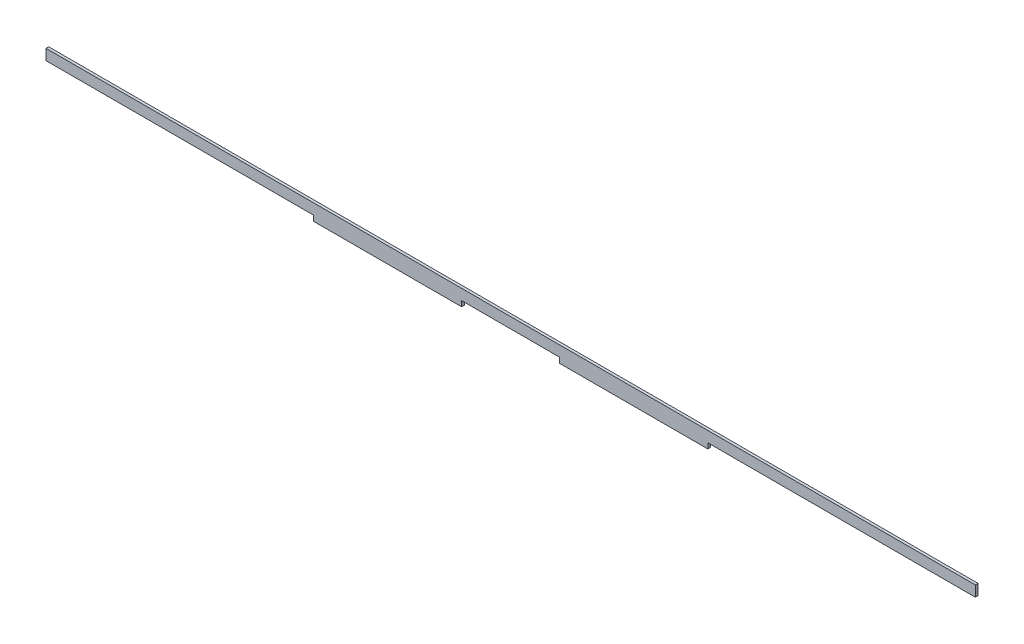
ISO-10303-21;
HEADER;
FILE_DESCRIPTION(('STEP AP214'),'2;1');
FILE_NAME('part.step','',(''),(''),'','','');
FILE_SCHEMA(('AUTOMOTIVE_DESIGN { 1 0 10303 214 1 1 1 1 }'));
ENDSEC;
DATA;
#1=APPLICATION_CONTEXT('core data for automotive mechanical design processes');
#2=APPLICATION_PROTOCOL_DEFINITION('international standard','automotive_design',2000,#1);
#3=PRODUCT_CONTEXT('',#1,'mechanical');
#4=PRODUCT('Part','Part','',(#3));
#5=PRODUCT_RELATED_PRODUCT_CATEGORY('part','',(#4));
#6=PRODUCT_DEFINITION_FORMATION('','',#4);
#7=PRODUCT_DEFINITION_CONTEXT('part definition',#1,'design');
#8=PRODUCT_DEFINITION('design','',#6,#7);
#9=PRODUCT_DEFINITION_SHAPE('','',#8);
#10=(LENGTH_UNIT() NAMED_UNIT(*) SI_UNIT(.MILLI.,.METRE.));
#11=(NAMED_UNIT(*) PLANE_ANGLE_UNIT() SI_UNIT($,.RADIAN.));
#12=(NAMED_UNIT(*) SI_UNIT($,.STERADIAN.) SOLID_ANGLE_UNIT());
#13=UNCERTAINTY_MEASURE_WITH_UNIT(LENGTH_MEASURE(1.E-05),#10,'distance_accuracy_value','');
#14=(GEOMETRIC_REPRESENTATION_CONTEXT(3) GLOBAL_UNCERTAINTY_ASSIGNED_CONTEXT((#13)) GLOBAL_UNIT_ASSIGNED_CONTEXT((#10,
#11,#12)) REPRESENTATION_CONTEXT('',''));
#15=CARTESIAN_POINT('',(0.,0.,0.));
#16=DIRECTION('',(0.,0.,1.));
#17=DIRECTION('',(1.,0.,0.));
#18=AXIS2_PLACEMENT_3D('',#15,#16,#17);
#19=CARTESIAN_POINT('',(49.8374939514051,7.71576479761275,3.));
#20=DIRECTION('',(1.,0.,0.));
#21=DIRECTION('',(0.,0.,-1.));
#22=AXIS2_PLACEMENT_3D('',#19,#20,#21);
#23=PLANE('',#22);
#24=DIRECTION('',(0.,-1.,0.));
#25=VECTOR('',#24,1.);
#26=CARTESIAN_POINT('',(49.8374939514051,7.71576479761275,0.));
#27=LINE('',#26,#25);
#28=CARTESIAN_POINT('',(49.8374939514051,7.71576479761275,0.));
#29=VERTEX_POINT('',#28);
#30=CARTESIAN_POINT('',(49.8374939514051,1.71576479761275,0.));
#31=VERTEX_POINT('',#30);
#32=EDGE_CURVE('E163',#29,#31,#27,.T.);
#33=ORIENTED_EDGE('',*,*,#32,.T.);
#34=DIRECTION('',(0.,0.,-1.));
#35=VECTOR('',#34,1.);
#36=CARTESIAN_POINT('',(49.8374939514051,1.71576479761275,3.));
#37=LINE('',#36,#35);
#38=CARTESIAN_POINT('',(49.8374939514051,1.71576479761275,3.));
#39=VERTEX_POINT('',#38);
#40=EDGE_CURVE('E11',#39,#31,#37,.T.);
#41=ORIENTED_EDGE('',*,*,#40,.F.);
#42=DIRECTION('',(0.,-1.,0.));
#43=VECTOR('',#42,1.);
#44=CARTESIAN_POINT('',(49.8374939514051,7.71576479761275,3.));
#45=LINE('',#44,#43);
#46=CARTESIAN_POINT('',(49.8374939514051,7.71576479761275,3.));
#47=VERTEX_POINT('',#46);
#48=EDGE_CURVE('E192',#47,#39,#45,.T.);
#49=ORIENTED_EDGE('',*,*,#48,.F.);
#50=DIRECTION('',(0.,0.,-1.));
#51=VECTOR('',#50,1.);
#52=CARTESIAN_POINT('',(49.8374939514051,7.71576479761275,3.));
#53=LINE('',#52,#51);
#54=EDGE_CURVE('E162',#47,#29,#53,.T.);
#55=ORIENTED_EDGE('',*,*,#54,.T.);
#56=EDGE_LOOP('',(#33,#41,#49,#55));
#57=FACE_BOUND('',#56,.T.);
#58=ADVANCED_FACE('F41',(#57),#23,.F.);
#59=CARTESIAN_POINT('',(49.8374939514051,1.71576479761275,3.));
#60=DIRECTION('',(0.,1.,0.));
#61=DIRECTION('',(-1.,0.,0.));
#62=AXIS2_PLACEMENT_3D('',#59,#60,#61);
#63=PLANE('',#62);
#64=DIRECTION('',(1.,0.,0.));
#65=VECTOR('',#64,1.);
#66=CARTESIAN_POINT('',(49.8374939514051,1.71576479761275,0.));
#67=LINE('',#66,#65);
#68=CARTESIAN_POINT('',(215.837493951405,1.71576479761275,0.));
#69=VERTEX_POINT('',#68);
#70=EDGE_CURVE('E166',#31,#69,#67,.T.);
#71=ORIENTED_EDGE('',*,*,#70,.T.);
#72=DIRECTION('',(0.,0.,-1.));
#73=VECTOR('',#72,1.);
#74=CARTESIAN_POINT('',(215.837493951405,1.71576479761275,3.));
#75=LINE('',#74,#73);
#76=CARTESIAN_POINT('',(215.837493951405,1.71576479761275,3.));
#77=VERTEX_POINT('',#76);
#78=EDGE_CURVE('E49',#77,#69,#75,.T.);
#79=ORIENTED_EDGE('',*,*,#78,.F.);
#80=DIRECTION('',(1.,0.,0.));
#81=VECTOR('',#80,1.);
#82=CARTESIAN_POINT('',(49.8374939514051,1.71576479761275,3.));
#83=LINE('',#82,#81);
#84=EDGE_CURVE('E111',#39,#77,#83,.T.);
#85=ORIENTED_EDGE('',*,*,#84,.F.);
#86=ORIENTED_EDGE('',*,*,#40,.T.);
#87=EDGE_LOOP('',(#71,#79,#85,#86));
#88=FACE_BOUND('',#87,.T.);
#89=ADVANCED_FACE('F261',(#88),#63,.F.);
#90=CARTESIAN_POINT('',(215.837493951405,1.71576479761275,3.));
#91=DIRECTION('',(-1.,0.,0.));
#92=DIRECTION('',(0.,0.,1.));
#93=AXIS2_PLACEMENT_3D('',#90,#91,#92);
#94=PLANE('',#93);
#95=DIRECTION('',(0.,1.,0.));
#96=VECTOR('',#95,1.);
#97=CARTESIAN_POINT('',(215.837493951405,1.71576479761275,0.));
#98=LINE('',#97,#96);
#99=CARTESIAN_POINT('',(215.837493951405,7.71576479761275,0.));
#100=VERTEX_POINT('',#99);
#101=EDGE_CURVE('E168',#69,#100,#98,.T.);
#102=ORIENTED_EDGE('',*,*,#101,.T.);
#103=DIRECTION('',(0.,0.,-1.));
#104=VECTOR('',#103,1.);
#105=CARTESIAN_POINT('',(215.837493951405,7.71576479761275,3.));
#106=LINE('',#105,#104);
#107=CARTESIAN_POINT('',(215.837493951405,7.71576479761275,3.));
#108=VERTEX_POINT('',#107);
#109=EDGE_CURVE('E206',#108,#100,#106,.T.);
#110=ORIENTED_EDGE('',*,*,#109,.F.);
#111=DIRECTION('',(0.,1.,0.));
#112=VECTOR('',#111,1.);
#113=CARTESIAN_POINT('',(215.837493951405,1.71576479761275,3.));
#114=LINE('',#113,#112);
#115=EDGE_CURVE('E213',#77,#108,#114,.T.);
#116=ORIENTED_EDGE('',*,*,#115,.F.);
#117=ORIENTED_EDGE('',*,*,#78,.T.);
#118=EDGE_LOOP('',(#102,#110,#116,#117));
#119=FACE_BOUND('',#118,.T.);
#120=ADVANCED_FACE('F211',(#119),#94,.F.);
#121=CARTESIAN_POINT('',(325.837493951405,7.71576479761275,3.));
#122=DIRECTION('',(0.,-1.,0.));
#123=DIRECTION('',(0.,0.,-1.));
#124=AXIS2_PLACEMENT_3D('',#121,#122,#123);
#125=PLANE('',#124);
#126=DIRECTION('',(-1.,0.,0.));
#127=VECTOR('',#126,1.);
#128=CARTESIAN_POINT('',(325.837493951405,7.71576479761275,0.));
#129=LINE('',#128,#127);
#130=CARTESIAN_POINT('',(325.837493951405,7.71576479761275,0.));
#131=VERTEX_POINT('',#130);
#132=EDGE_CURVE('E171',#131,#100,#129,.T.);
#133=ORIENTED_EDGE('',*,*,#132,.F.);
#134=DIRECTION('',(0.,0.,-1.));
#135=VECTOR('',#134,1.);
#136=CARTESIAN_POINT('',(325.837493951405,7.71576479761275,3.));
#137=LINE('',#136,#135);
#138=CARTESIAN_POINT('',(325.837493951405,7.71576479761275,3.));
#139=VERTEX_POINT('',#138);
#140=EDGE_CURVE('E204',#139,#131,#137,.T.);
#141=ORIENTED_EDGE('',*,*,#140,.F.);
#142=DIRECTION('',(-1.,0.,0.));
#143=VECTOR('',#142,1.);
#144=CARTESIAN_POINT('',(325.837493951405,7.71576479761275,3.));
#145=LINE('',#144,#143);
#146=EDGE_CURVE('E223',#139,#108,#145,.T.);
#147=ORIENTED_EDGE('',*,*,#146,.T.);
#148=ORIENTED_EDGE('',*,*,#109,.T.);
#149=EDGE_LOOP('',(#133,#141,#147,#148));
#150=FACE_BOUND('',#149,.T.);
#151=ADVANCED_FACE('F220',(#150),#125,.T.);
#152=CARTESIAN_POINT('',(325.837493951405,1.71576479761275,3.));
#153=DIRECTION('',(-1.,0.,0.));
#154=DIRECTION('',(0.,0.,1.));
#155=AXIS2_PLACEMENT_3D('',#152,#153,#154);
#156=PLANE('',#155);
#157=DIRECTION('',(0.,1.,0.));
#158=VECTOR('',#157,1.);
#159=CARTESIAN_POINT('',(325.837493951405,1.71576479761275,0.));
#160=LINE('',#159,#158);
#161=CARTESIAN_POINT('',(325.837493951405,1.71576479761275,0.));
#162=VERTEX_POINT('',#161);
#163=EDGE_CURVE('E174',#162,#131,#160,.T.);
#164=ORIENTED_EDGE('',*,*,#163,.F.);
#165=DIRECTION('',(0.,0.,-1.));
#166=VECTOR('',#165,1.);
#167=CARTESIAN_POINT('',(325.837493951405,1.71576479761275,3.));
#168=LINE('',#167,#166);
#169=CARTESIAN_POINT('',(325.837493951405,1.71576479761275,3.));
#170=VERTEX_POINT('',#169);
#171=EDGE_CURVE('E202',#170,#162,#168,.T.);
#172=ORIENTED_EDGE('',*,*,#171,.F.);
#173=DIRECTION('',(0.,1.,0.));
#174=VECTOR('',#173,1.);
#175=CARTESIAN_POINT('',(325.837493951405,1.71576479761275,3.));
#176=LINE('',#175,#174);
#177=EDGE_CURVE('E226',#170,#139,#176,.T.);
#178=ORIENTED_EDGE('',*,*,#177,.T.);
#179=ORIENTED_EDGE('',*,*,#140,.T.);
#180=EDGE_LOOP('',(#164,#172,#178,#179));
#181=FACE_BOUND('',#180,.T.);
#182=ADVANCED_FACE('F272',(#181),#156,.T.);
#183=CARTESIAN_POINT('',(491.837493951405,1.71576479761275,3.));
#184=DIRECTION('',(0.,-1.,0.));
#185=DIRECTION('',(1.,0.,0.));
#186=AXIS2_PLACEMENT_3D('',#183,#184,#185);
#187=PLANE('',#186);
#188=DIRECTION('',(-1.,0.,0.));
#189=VECTOR('',#188,1.);
#190=CARTESIAN_POINT('',(491.837493951405,1.71576479761275,0.));
#191=LINE('',#190,#189);
#192=CARTESIAN_POINT('',(491.837493951405,1.71576479761275,0.));
#193=VERTEX_POINT('',#192);
#194=EDGE_CURVE('E177',#193,#162,#191,.T.);
#195=ORIENTED_EDGE('',*,*,#194,.F.);
#196=DIRECTION('',(0.,0.,-1.));
#197=VECTOR('',#196,1.);
#198=CARTESIAN_POINT('',(491.837493951405,1.71576479761275,3.));
#199=LINE('',#198,#197);
#200=CARTESIAN_POINT('',(491.837493951405,1.71576479761275,3.));
#201=VERTEX_POINT('',#200);
#202=EDGE_CURVE('E200',#201,#193,#199,.T.);
#203=ORIENTED_EDGE('',*,*,#202,.F.);
#204=DIRECTION('',(-1.,0.,0.));
#205=VECTOR('',#204,1.);
#206=CARTESIAN_POINT('',(491.837493951405,1.71576479761275,3.));
#207=LINE('',#206,#205);
#208=EDGE_CURVE('E228',#201,#170,#207,.T.);
#209=ORIENTED_EDGE('',*,*,#208,.T.);
#210=ORIENTED_EDGE('',*,*,#171,.T.);
#211=EDGE_LOOP('',(#195,#203,#209,#210));
#212=FACE_BOUND('',#211,.T.);
#213=ADVANCED_FACE('F275',(#212),#187,.T.);
#214=CARTESIAN_POINT('',(491.837493951405,7.71576479761275,3.));
#215=DIRECTION('',(1.,0.,0.));
#216=DIRECTION('',(0.,0.,-1.));
#217=AXIS2_PLACEMENT_3D('',#214,#215,#216);
#218=PLANE('',#217);
#219=DIRECTION('',(0.,-1.,0.));
#220=VECTOR('',#219,1.);
#221=CARTESIAN_POINT('',(491.837493951405,7.71576479761275,0.));
#222=LINE('',#221,#220);
#223=CARTESIAN_POINT('',(491.837493951405,7.71576479761275,0.));
#224=VERTEX_POINT('',#223);
#225=EDGE_CURVE('E180',#224,#193,#222,.T.);
#226=ORIENTED_EDGE('',*,*,#225,.F.);
#227=DIRECTION('',(0.,0.,-1.));
#228=VECTOR('',#227,1.);
#229=CARTESIAN_POINT('',(491.837493951405,7.71576479761275,3.));
#230=LINE('',#229,#228);
#231=CARTESIAN_POINT('',(491.837493951405,7.71576479761275,3.));
#232=VERTEX_POINT('',#231);
#233=EDGE_CURVE('E198',#232,#224,#230,.T.);
#234=ORIENTED_EDGE('',*,*,#233,.F.);
#235=DIRECTION('',(0.,-1.,0.));
#236=VECTOR('',#235,1.);
#237=CARTESIAN_POINT('',(491.837493951405,7.71576479761275,3.));
#238=LINE('',#237,#236);
#239=EDGE_CURVE('E235',#232,#201,#238,.T.);
#240=ORIENTED_EDGE('',*,*,#239,.T.);
#241=ORIENTED_EDGE('',*,*,#202,.T.);
#242=EDGE_LOOP('',(#226,#234,#240,#241));
#243=FACE_BOUND('',#242,.T.);
#244=ADVANCED_FACE('F279',(#243),#218,.T.);
#245=CARTESIAN_POINT('',(791.837493951405,7.71576479761275,3.));
#246=DIRECTION('',(0.,-1.,0.));
#247=DIRECTION('',(0.,0.,-1.));
#248=AXIS2_PLACEMENT_3D('',#245,#246,#247);
#249=PLANE('',#248);
#250=DIRECTION('',(-1.,0.,0.));
#251=VECTOR('',#250,1.);
#252=CARTESIAN_POINT('',(791.837493951405,7.71576479761275,0.));
#253=LINE('',#252,#251);
#254=CARTESIAN_POINT('',(791.837493951405,7.71576479761275,0.));
#255=VERTEX_POINT('',#254);
#256=EDGE_CURVE('E183',#255,#224,#253,.T.);
#257=ORIENTED_EDGE('',*,*,#256,.F.);
#258=DIRECTION('',(0.,0.,-1.));
#259=VECTOR('',#258,1.);
#260=CARTESIAN_POINT('',(791.837493951405,7.71576479761275,3.));
#261=LINE('',#260,#259);
#262=CARTESIAN_POINT('',(791.837493951405,7.71576479761275,3.));
#263=VERTEX_POINT('',#262);
#264=EDGE_CURVE('E196',#263,#255,#261,.T.);
#265=ORIENTED_EDGE('',*,*,#264,.F.);
#266=DIRECTION('',(-1.,0.,0.));
#267=VECTOR('',#266,1.);
#268=CARTESIAN_POINT('',(791.837493951405,7.71576479761275,3.));
#269=LINE('',#268,#267);
#270=EDGE_CURVE('E157',#263,#232,#269,.T.);
#271=ORIENTED_EDGE('',*,*,#270,.T.);
#272=ORIENTED_EDGE('',*,*,#233,.T.);
#273=EDGE_LOOP('',(#257,#265,#271,#272));
#274=FACE_BOUND('',#273,.T.);
#275=ADVANCED_FACE('F240',(#274),#249,.T.);
#276=CARTESIAN_POINT('',(791.837493951405,19.7157647976127,3.));
#277=DIRECTION('',(1.,0.,0.));
#278=DIRECTION('',(0.,0.,-1.));
#279=AXIS2_PLACEMENT_3D('',#276,#277,#278);
#280=PLANE('',#279);
#281=DIRECTION('',(0.,-1.,0.));
#282=VECTOR('',#281,1.);
#283=CARTESIAN_POINT('',(791.837493951405,19.7157647976127,0.));
#284=LINE('',#283,#282);
#285=CARTESIAN_POINT('',(791.837493951405,19.7157647976127,0.));
#286=VERTEX_POINT('',#285);
#287=EDGE_CURVE('E186',#286,#255,#284,.T.);
#288=ORIENTED_EDGE('',*,*,#287,.F.);
#289=DIRECTION('',(0.,0.,-1.));
#290=VECTOR('',#289,1.);
#291=CARTESIAN_POINT('',(791.837493951405,19.7157647976127,3.));
#292=LINE('',#291,#290);
#293=CARTESIAN_POINT('',(791.837493951405,19.7157647976127,3.));
#294=VERTEX_POINT('',#293);
#295=EDGE_CURVE('E145',#294,#286,#292,.T.);
#296=ORIENTED_EDGE('',*,*,#295,.F.);
#297=DIRECTION('',(0.,-1.,0.));
#298=VECTOR('',#297,1.);
#299=CARTESIAN_POINT('',(791.837493951405,19.7157647976127,3.));
#300=LINE('',#299,#298);
#301=EDGE_CURVE('E155',#294,#263,#300,.T.);
#302=ORIENTED_EDGE('',*,*,#301,.T.);
#303=ORIENTED_EDGE('',*,*,#264,.T.);
#304=EDGE_LOOP('',(#288,#296,#302,#303));
#305=FACE_BOUND('',#304,.T.);
#306=ADVANCED_FACE('F246',(#305),#280,.T.);
#307=CARTESIAN_POINT('',(-250.162506048595,19.7157647976127,3.));
#308=DIRECTION('',(0.,1.,0.));
#309=DIRECTION('',(0.,0.,1.));
#310=AXIS2_PLACEMENT_3D('',#307,#308,#309);
#311=PLANE('',#310);
#312=DIRECTION('',(1.,0.,0.));
#313=VECTOR('',#312,1.);
#314=CARTESIAN_POINT('',(-250.162506048595,19.7157647976127,0.));
#315=LINE('',#314,#313);
#316=CARTESIAN_POINT('',(-250.162506048595,19.7157647976127,0.));
#317=VERTEX_POINT('',#316);
#318=EDGE_CURVE('E144',#317,#286,#315,.T.);
#319=ORIENTED_EDGE('',*,*,#318,.F.);
#320=DIRECTION('',(0.,0.,-1.));
#321=VECTOR('',#320,1.);
#322=CARTESIAN_POINT('',(-250.162506048595,19.7157647976127,3.));
#323=LINE('',#322,#321);
#324=CARTESIAN_POINT('',(-250.162506048595,19.7157647976127,3.));
#325=VERTEX_POINT('',#324);
#326=EDGE_CURVE('E138',#325,#317,#323,.T.);
#327=ORIENTED_EDGE('',*,*,#326,.F.);
#328=DIRECTION('',(1.,0.,0.));
#329=VECTOR('',#328,1.);
#330=CARTESIAN_POINT('',(-250.162506048595,19.7157647976127,3.));
#331=LINE('',#330,#329);
#332=EDGE_CURVE('E142',#325,#294,#331,.T.);
#333=ORIENTED_EDGE('',*,*,#332,.T.);
#334=ORIENTED_EDGE('',*,*,#295,.T.);
#335=EDGE_LOOP('',(#319,#327,#333,#334));
#336=FACE_BOUND('',#335,.T.);
#337=ADVANCED_FACE('F140',(#336),#311,.T.);
#338=CARTESIAN_POINT('',(-250.162506048595,19.7157647976127,3.));
#339=DIRECTION('',(1.,0.,0.));
#340=DIRECTION('',(0.,0.,-1.));
#341=AXIS2_PLACEMENT_3D('',#338,#339,#340);
#342=PLANE('',#341);
#343=DIRECTION('',(0.,-1.,0.));
#344=VECTOR('',#343,1.);
#345=CARTESIAN_POINT('',(-250.162506048595,19.7157647976127,0.));
#346=LINE('',#345,#344);
#347=CARTESIAN_POINT('',(-250.162506048595,7.71576479761275,0.));
#348=VERTEX_POINT('',#347);
#349=EDGE_CURVE('E97',#317,#348,#346,.T.);
#350=ORIENTED_EDGE('',*,*,#349,.T.);
#351=DIRECTION('',(0.,0.,-1.));
#352=VECTOR('',#351,1.);
#353=CARTESIAN_POINT('',(-250.162506048595,7.71576479761275,3.));
#354=LINE('',#353,#352);
#355=CARTESIAN_POINT('',(-250.162506048595,7.71576479761275,3.));
#356=VERTEX_POINT('',#355);
#357=EDGE_CURVE('E146',#356,#348,#354,.T.);
#358=ORIENTED_EDGE('',*,*,#357,.F.);
#359=DIRECTION('',(0.,-1.,0.));
#360=VECTOR('',#359,1.);
#361=CARTESIAN_POINT('',(-250.162506048595,19.7157647976127,3.));
#362=LINE('',#361,#360);
#363=EDGE_CURVE('E148',#325,#356,#362,.T.);
#364=ORIENTED_EDGE('',*,*,#363,.F.);
#365=ORIENTED_EDGE('',*,*,#326,.T.);
#366=EDGE_LOOP('',(#350,#358,#364,#365));
#367=FACE_BOUND('',#366,.T.);
#368=ADVANCED_FACE('F149',(#367),#342,.F.);
#369=CARTESIAN_POINT('',(-250.162506048595,7.71576479761275,3.));
#370=DIRECTION('',(0.,1.,0.));
#371=DIRECTION('',(0.,0.,1.));
#372=AXIS2_PLACEMENT_3D('',#369,#370,#371);
#373=PLANE('',#372);
#374=DIRECTION('',(1.,0.,0.));
#375=VECTOR('',#374,1.);
#376=CARTESIAN_POINT('',(-250.162506048595,7.71576479761275,0.));
#377=LINE('',#376,#375);
#378=EDGE_CURVE('E103',#348,#29,#377,.T.);
#379=ORIENTED_EDGE('',*,*,#378,.T.);
#380=ORIENTED_EDGE('',*,*,#54,.F.);
#381=DIRECTION('',(1.,0.,0.));
#382=VECTOR('',#381,1.);
#383=CARTESIAN_POINT('',(-250.162506048595,7.71576479761275,3.));
#384=LINE('',#383,#382);
#385=EDGE_CURVE('E57',#356,#47,#384,.T.);
#386=ORIENTED_EDGE('',*,*,#385,.F.);
#387=ORIENTED_EDGE('',*,*,#357,.T.);
#388=EDGE_LOOP('',(#379,#380,#386,#387));
#389=FACE_BOUND('',#388,.T.);
#390=ADVANCED_FACE('F250',(#389),#373,.F.);
#391=CARTESIAN_POINT('',(0.,0.,3.));
#392=DIRECTION('',(0.,0.,1.));
#393=DIRECTION('',(1.,0.,0.));
#394=AXIS2_PLACEMENT_3D('',#391,#392,#393);
#395=PLANE('',#394);
#396=ORIENTED_EDGE('',*,*,#48,.T.);
#397=ORIENTED_EDGE('',*,*,#84,.T.);
#398=ORIENTED_EDGE('',*,*,#115,.T.);
#399=ORIENTED_EDGE('',*,*,#146,.F.);
#400=ORIENTED_EDGE('',*,*,#177,.F.);
#401=ORIENTED_EDGE('',*,*,#208,.F.);
#402=ORIENTED_EDGE('',*,*,#239,.F.);
#403=ORIENTED_EDGE('',*,*,#270,.F.);
#404=ORIENTED_EDGE('',*,*,#301,.F.);
#405=ORIENTED_EDGE('',*,*,#332,.F.);
#406=ORIENTED_EDGE('',*,*,#363,.T.);
#407=ORIENTED_EDGE('',*,*,#385,.T.);
#408=EDGE_LOOP('',(#396,#397,#398,#399,#400,#401,#402,#403,#404,#405,#406,#407));
#409=FACE_BOUND('',#408,.T.);
#410=ADVANCED_FACE('F152',(#409),#395,.T.);
#411=CARTESIAN_POINT('',(0.,0.,0.));
#412=DIRECTION('',(0.,0.,1.));
#413=DIRECTION('',(1.,0.,0.));
#414=AXIS2_PLACEMENT_3D('',#411,#412,#413);
#415=PLANE('',#414);
#416=ORIENTED_EDGE('',*,*,#32,.F.);
#417=ORIENTED_EDGE('',*,*,#378,.F.);
#418=ORIENTED_EDGE('',*,*,#349,.F.);
#419=ORIENTED_EDGE('',*,*,#318,.T.);
#420=ORIENTED_EDGE('',*,*,#287,.T.);
#421=ORIENTED_EDGE('',*,*,#256,.T.);
#422=ORIENTED_EDGE('',*,*,#225,.T.);
#423=ORIENTED_EDGE('',*,*,#194,.T.);
#424=ORIENTED_EDGE('',*,*,#163,.T.);
#425=ORIENTED_EDGE('',*,*,#132,.T.);
#426=ORIENTED_EDGE('',*,*,#101,.F.);
#427=ORIENTED_EDGE('',*,*,#70,.F.);
#428=EDGE_LOOP('',(#416,#417,#418,#419,#420,#421,#422,#423,#424,#425,#426,#427));
#429=FACE_BOUND('',#428,.T.);
#430=ADVANCED_FACE('F216',(#429),#415,.F.);
#431=CLOSED_SHELL('',(#58,#89,#120,#151,#182,#213,#244,#275,#306,#337,#368,#390,#410,#430));
#432=MANIFOLD_SOLID_BREP('B2',#431);
#433=ADVANCED_BREP_SHAPE_REPRESENTATION('',(#18,#432),#14);
#434=SHAPE_DEFINITION_REPRESENTATION(#9,#433);
ENDSEC;
END-ISO-10303-21;
